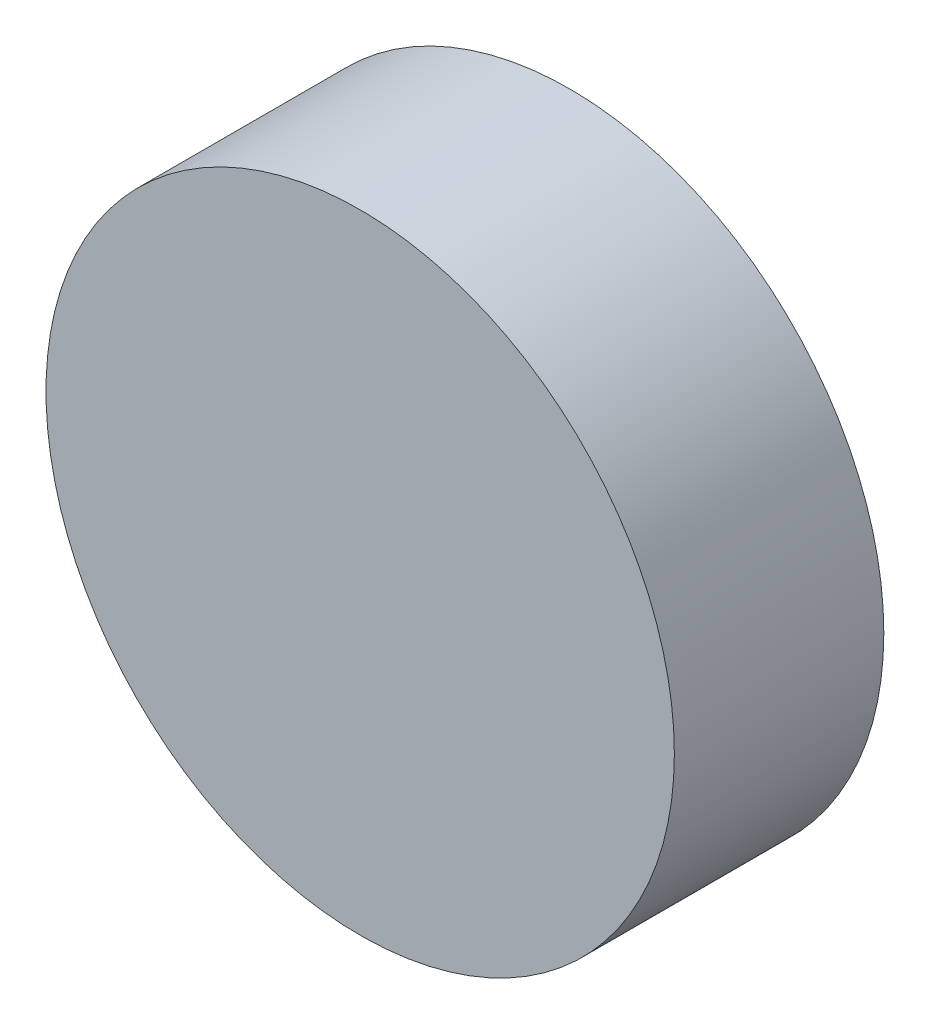
ISO-10303-21;
HEADER;
FILE_DESCRIPTION(('STEP AP214'),'2;1');
FILE_NAME('part.step','',(''),(''),'','','');
FILE_SCHEMA(('AUTOMOTIVE_DESIGN { 1 0 10303 214 1 1 1 1 }'));
ENDSEC;
DATA;
#1=APPLICATION_CONTEXT('core data for automotive mechanical design processes');
#2=APPLICATION_PROTOCOL_DEFINITION('international standard','automotive_design',2000,#1);
#3=PRODUCT_CONTEXT('',#1,'mechanical');
#4=PRODUCT('Part','Part','',(#3));
#5=PRODUCT_RELATED_PRODUCT_CATEGORY('part','',(#4));
#6=PRODUCT_DEFINITION_FORMATION('','',#4);
#7=PRODUCT_DEFINITION_CONTEXT('part definition',#1,'design');
#8=PRODUCT_DEFINITION('design','',#6,#7);
#9=PRODUCT_DEFINITION_SHAPE('','',#8);
#10=(LENGTH_UNIT() NAMED_UNIT(*) SI_UNIT(.MILLI.,.METRE.));
#11=(NAMED_UNIT(*) PLANE_ANGLE_UNIT() SI_UNIT($,.RADIAN.));
#12=(NAMED_UNIT(*) SI_UNIT($,.STERADIAN.) SOLID_ANGLE_UNIT());
#13=UNCERTAINTY_MEASURE_WITH_UNIT(LENGTH_MEASURE(1.E-05),#10,'distance_accuracy_value','');
#14=(GEOMETRIC_REPRESENTATION_CONTEXT(3) GLOBAL_UNCERTAINTY_ASSIGNED_CONTEXT((#13)) GLOBAL_UNIT_ASSIGNED_CONTEXT((#10,
#11,#12)) REPRESENTATION_CONTEXT('',''));
#15=CARTESIAN_POINT('',(0.,0.,0.));
#16=DIRECTION('',(0.,0.,1.));
#17=DIRECTION('',(1.,0.,0.));
#18=AXIS2_PLACEMENT_3D('',#15,#16,#17);
#19=CARTESIAN_POINT('',(0.,0.,5.));
#20=DIRECTION('',(0.,0.,-1.));
#21=DIRECTION('',(0.,-1.,0.));
#22=AXIS2_PLACEMENT_3D('',#19,#20,#21);
#23=CYLINDRICAL_SURFACE('',#22,7.5);
#24=CARTESIAN_POINT('',(0.,0.,5.));
#25=DIRECTION('',(0.,0.,1.));
#26=DIRECTION('',(1.,0.,0.));
#27=AXIS2_PLACEMENT_3D('',#24,#25,#26);
#28=CIRCLE('',#27,7.5);
#29=CARTESIAN_POINT('',(7.5,0.,5.));
#30=VERTEX_POINT('',#29);
#31=EDGE_CURVE('E23',#30,#30,#28,.T.);
#32=ORIENTED_EDGE('',*,*,#31,.F.);
#33=EDGE_LOOP('',(#32));
#34=FACE_BOUND('',#33,.T.);
#35=CARTESIAN_POINT('',(0.,0.,0.));
#36=DIRECTION('',(0.,0.,1.));
#37=DIRECTION('',(1.,0.,0.));
#38=AXIS2_PLACEMENT_3D('',#35,#36,#37);
#39=CIRCLE('',#38,7.5);
#40=CARTESIAN_POINT('',(7.5,0.,0.));
#41=VERTEX_POINT('',#40);
#42=EDGE_CURVE('E10',#41,#41,#39,.T.);
#43=ORIENTED_EDGE('',*,*,#42,.T.);
#44=EDGE_LOOP('',(#43));
#45=FACE_BOUND('',#44,.T.);
#46=ADVANCED_FACE('F15',(#34,#45),#23,.T.);
#47=CARTESIAN_POINT('',(0.,0.,5.));
#48=DIRECTION('',(0.,0.,1.));
#49=DIRECTION('',(1.,0.,0.));
#50=AXIS2_PLACEMENT_3D('',#47,#48,#49);
#51=PLANE('',#50);
#52=ORIENTED_EDGE('',*,*,#31,.T.);
#53=EDGE_LOOP('',(#52));
#54=FACE_BOUND('',#53,.T.);
#55=ADVANCED_FACE('F32',(#54),#51,.T.);
#56=CARTESIAN_POINT('',(0.,0.,0.));
#57=DIRECTION('',(0.,0.,1.));
#58=DIRECTION('',(1.,0.,0.));
#59=AXIS2_PLACEMENT_3D('',#56,#57,#58);
#60=PLANE('',#59);
#61=ORIENTED_EDGE('',*,*,#42,.F.);
#62=EDGE_LOOP('',(#61));
#63=FACE_BOUND('',#62,.T.);
#64=ADVANCED_FACE('F39',(#63),#60,.F.);
#65=CLOSED_SHELL('',(#46,#55,#64));
#66=MANIFOLD_SOLID_BREP('B1',#65);
#67=ADVANCED_BREP_SHAPE_REPRESENTATION('',(#18,#66),#14);
#68=SHAPE_DEFINITION_REPRESENTATION(#9,#67);
ENDSEC;
END-ISO-10303-21;
